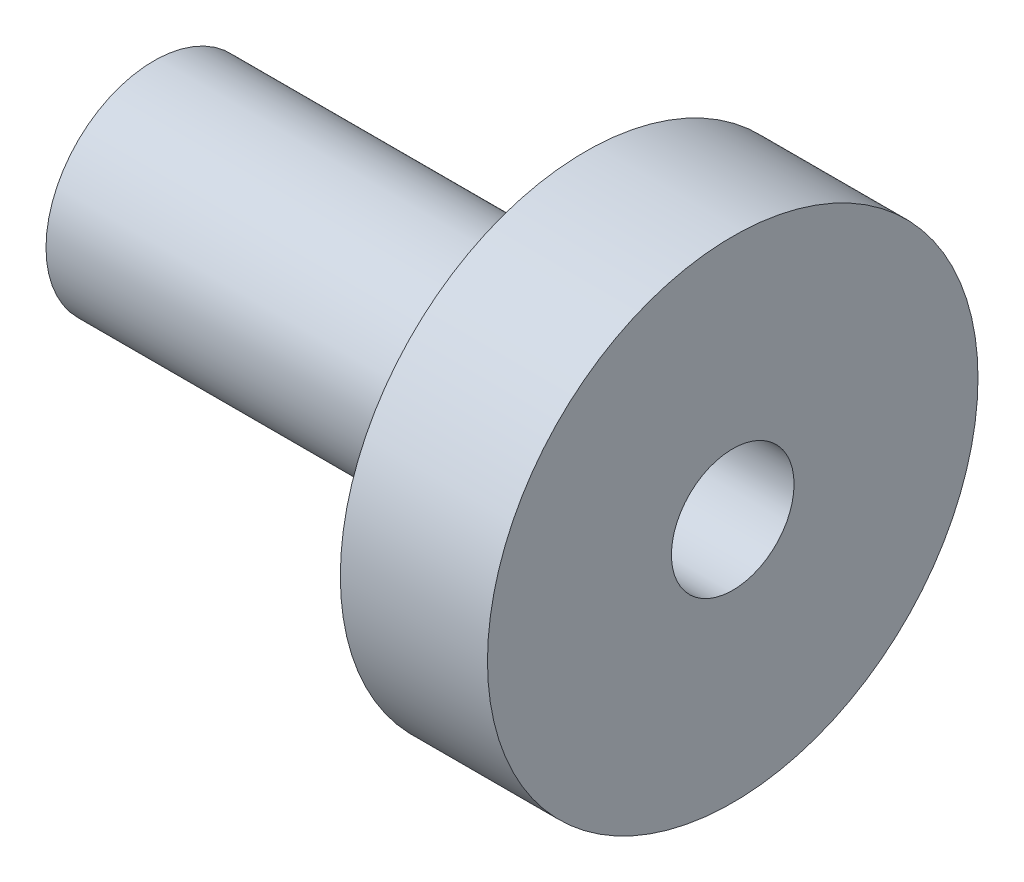
ISO-10303-21;
HEADER;
FILE_DESCRIPTION(('STEP AP214'),'2;1');
FILE_NAME('part.step','',(''),(''),'','','');
FILE_SCHEMA(('AUTOMOTIVE_DESIGN { 1 0 10303 214 1 1 1 1 }'));
ENDSEC;
DATA;
#1=APPLICATION_CONTEXT('core data for automotive mechanical design processes');
#2=APPLICATION_PROTOCOL_DEFINITION('international standard','automotive_design',2000,#1);
#3=PRODUCT_CONTEXT('',#1,'mechanical');
#4=PRODUCT('Part','Part','',(#3));
#5=PRODUCT_RELATED_PRODUCT_CATEGORY('part','',(#4));
#6=PRODUCT_DEFINITION_FORMATION('','',#4);
#7=PRODUCT_DEFINITION_CONTEXT('part definition',#1,'design');
#8=PRODUCT_DEFINITION('design','',#6,#7);
#9=PRODUCT_DEFINITION_SHAPE('','',#8);
#10=(LENGTH_UNIT() NAMED_UNIT(*) SI_UNIT(.MILLI.,.METRE.));
#11=(NAMED_UNIT(*) PLANE_ANGLE_UNIT() SI_UNIT($,.RADIAN.));
#12=(NAMED_UNIT(*) SI_UNIT($,.STERADIAN.) SOLID_ANGLE_UNIT());
#13=UNCERTAINTY_MEASURE_WITH_UNIT(LENGTH_MEASURE(1.E-05),#10,'distance_accuracy_value','');
#14=(GEOMETRIC_REPRESENTATION_CONTEXT(3) GLOBAL_UNCERTAINTY_ASSIGNED_CONTEXT((#13)) GLOBAL_UNIT_ASSIGNED_CONTEXT((#10,
#11,#12)) REPRESENTATION_CONTEXT('',''));
#15=CARTESIAN_POINT('',(0.,0.,0.));
#16=DIRECTION('',(0.,0.,1.));
#17=DIRECTION('',(1.,0.,0.));
#18=AXIS2_PLACEMENT_3D('',#15,#16,#17);
#19=CARTESIAN_POINT('',(0.,0.,0.));
#20=DIRECTION('',(-1.,0.,0.));
#21=DIRECTION('',(0.,0.,1.));
#22=AXIS2_PLACEMENT_3D('',#19,#20,#21);
#23=PLANE('',#22);
#24=CARTESIAN_POINT('',(0.,0.,0.));
#25=DIRECTION('',(1.,0.,0.));
#26=DIRECTION('',(0.,0.,-1.));
#27=AXIS2_PLACEMENT_3D('',#24,#25,#26);
#28=CIRCLE('',#27,1.5875);
#29=CARTESIAN_POINT('',(0.,0.,-1.5875));
#30=VERTEX_POINT('',#29);
#31=EDGE_CURVE('E57',#30,#30,#28,.T.);
#32=ORIENTED_EDGE('',*,*,#31,.F.);
#33=EDGE_LOOP('',(#32));
#34=FACE_BOUND('',#33,.T.);
#35=CARTESIAN_POINT('',(0.,0.,0.));
#36=DIRECTION('',(-1.,0.,0.));
#37=DIRECTION('',(0.,0.,1.));
#38=AXIS2_PLACEMENT_3D('',#35,#36,#37);
#39=CIRCLE('',#38,6.35);
#40=CARTESIAN_POINT('',(0.,0.,6.35));
#41=VERTEX_POINT('',#40);
#42=EDGE_CURVE('E11',#41,#41,#39,.T.);
#43=ORIENTED_EDGE('',*,*,#42,.F.);
#44=EDGE_LOOP('',(#43));
#45=FACE_BOUND('',#44,.T.);
#46=ADVANCED_FACE('F39',(#34,#45),#23,.F.);
#47=CARTESIAN_POINT('',(-1364.97874230598,0.,0.));
#48=DIRECTION('',(-1.,0.,0.));
#49=DIRECTION('',(0.,0.,1.));
#50=AXIS2_PLACEMENT_3D('',#47,#48,#49);
#51=CYLINDRICAL_SURFACE('',#50,6.35);
#52=CARTESIAN_POINT('',(-3.81000000000009,0.,0.));
#53=DIRECTION('',(-1.,0.,0.));
#54=DIRECTION('',(0.,0.,1.));
#55=AXIS2_PLACEMENT_3D('',#52,#53,#54);
#56=CIRCLE('',#55,6.35);
#57=CARTESIAN_POINT('',(-3.81000000000009,0.,6.35));
#58=VERTEX_POINT('',#57);
#59=EDGE_CURVE('E45',#58,#58,#56,.T.);
#60=ORIENTED_EDGE('',*,*,#59,.F.);
#61=EDGE_LOOP('',(#60));
#62=FACE_BOUND('',#61,.T.);
#63=ORIENTED_EDGE('',*,*,#42,.T.);
#64=EDGE_LOOP('',(#63));
#65=FACE_BOUND('',#64,.T.);
#66=ADVANCED_FACE('F72',(#62,#65),#51,.T.);
#67=CARTESIAN_POINT('',(-3.81,6.35,0.));
#68=DIRECTION('',(1.,0.,0.));
#69=DIRECTION('',(0.,0.,-1.));
#70=AXIS2_PLACEMENT_3D('',#67,#68,#69);
#71=PLANE('',#70);
#72=CARTESIAN_POINT('',(-3.81000000000009,0.,0.));
#73=DIRECTION('',(-1.,0.,0.));
#74=DIRECTION('',(0.,0.,1.));
#75=AXIS2_PLACEMENT_3D('',#72,#73,#74);
#76=CIRCLE('',#75,2.794);
#77=CARTESIAN_POINT('',(-3.81000000000009,0.,2.794));
#78=VERTEX_POINT('',#77);
#79=EDGE_CURVE('E65',#78,#78,#76,.T.);
#80=ORIENTED_EDGE('',*,*,#79,.F.);
#81=EDGE_LOOP('',(#80));
#82=FACE_BOUND('',#81,.T.);
#83=ORIENTED_EDGE('',*,*,#59,.T.);
#84=EDGE_LOOP('',(#83));
#85=FACE_BOUND('',#84,.T.);
#86=ADVANCED_FACE('F70',(#82,#85),#71,.F.);
#87=CARTESIAN_POINT('',(-1364.97874230598,0.,0.));
#88=DIRECTION('',(-1.,0.,0.));
#89=DIRECTION('',(0.,0.,1.));
#90=AXIS2_PLACEMENT_3D('',#87,#88,#89);
#91=CYLINDRICAL_SURFACE('',#90,2.794);
#92=CARTESIAN_POINT('',(-14.9859999999999,0.,0.));
#93=DIRECTION('',(-1.,0.,0.));
#94=DIRECTION('',(0.,0.,1.));
#95=AXIS2_PLACEMENT_3D('',#92,#93,#94);
#96=CIRCLE('',#95,2.794);
#97=CARTESIAN_POINT('',(-14.9859999999999,0.,2.794));
#98=VERTEX_POINT('',#97);
#99=EDGE_CURVE('E60',#98,#98,#96,.T.);
#100=ORIENTED_EDGE('',*,*,#99,.F.);
#101=EDGE_LOOP('',(#100));
#102=FACE_BOUND('',#101,.T.);
#103=ORIENTED_EDGE('',*,*,#79,.T.);
#104=EDGE_LOOP('',(#103));
#105=FACE_BOUND('',#104,.T.);
#106=ADVANCED_FACE('F89',(#102,#105),#91,.T.);
#107=CARTESIAN_POINT('',(-14.986,2.794,0.));
#108=DIRECTION('',(1.,0.,0.));
#109=DIRECTION('',(0.,0.,-1.));
#110=AXIS2_PLACEMENT_3D('',#107,#108,#109);
#111=PLANE('',#110);
#112=ORIENTED_EDGE('',*,*,#99,.T.);
#113=EDGE_LOOP('',(#112));
#114=FACE_BOUND('',#113,.T.);
#115=ADVANCED_FACE('F85',(#114),#111,.F.);
#116=CARTESIAN_POINT('',(0.,0.,0.));
#117=DIRECTION('',(1.,0.,0.));
#118=DIRECTION('',(0.,0.,-1.));
#119=AXIS2_PLACEMENT_3D('',#116,#117,#118);
#120=CYLINDRICAL_SURFACE('',#119,1.5875);
#121=CARTESIAN_POINT('',(-2.54,0.,0.));
#122=DIRECTION('',(1.,0.,0.));
#123=DIRECTION('',(0.,0.,-1.));
#124=AXIS2_PLACEMENT_3D('',#121,#122,#123);
#125=CIRCLE('',#124,1.5875);
#126=CARTESIAN_POINT('',(-2.54,0.,-1.5875));
#127=VERTEX_POINT('',#126);
#128=EDGE_CURVE('E55',#127,#127,#125,.T.);
#129=ORIENTED_EDGE('',*,*,#128,.F.);
#130=EDGE_LOOP('',(#129));
#131=FACE_BOUND('',#130,.T.);
#132=ORIENTED_EDGE('',*,*,#31,.T.);
#133=EDGE_LOOP('',(#132));
#134=FACE_BOUND('',#133,.T.);
#135=ADVANCED_FACE('F51',(#131,#134),#120,.F.);
#136=CARTESIAN_POINT('',(-2.54,0.,0.));
#137=DIRECTION('',(1.,0.,0.));
#138=DIRECTION('',(0.,0.,-1.));
#139=AXIS2_PLACEMENT_3D('',#136,#137,#138);
#140=CONICAL_SURFACE('',#139,1.5875,1.02974425867665);
#141=CARTESIAN_POINT('',(-3.49386623270626,0.,0.));
#142=VERTEX_POINT('',#141);
#143=VERTEX_LOOP('',#142);
#144=FACE_BOUND('',#143,.T.);
#145=ORIENTED_EDGE('',*,*,#128,.T.);
#146=EDGE_LOOP('',(#145));
#147=FACE_BOUND('',#146,.T.);
#148=ADVANCED_FACE('F48',(#144,#147),#140,.F.);
#149=CLOSED_SHELL('',(#46,#66,#86,#106,#115,#135,#148));
#150=MANIFOLD_SOLID_BREP('B2',#149);
#151=ADVANCED_BREP_SHAPE_REPRESENTATION('',(#18,#150),#14);
#152=SHAPE_DEFINITION_REPRESENTATION(#9,#151);
ENDSEC;
END-ISO-10303-21;
